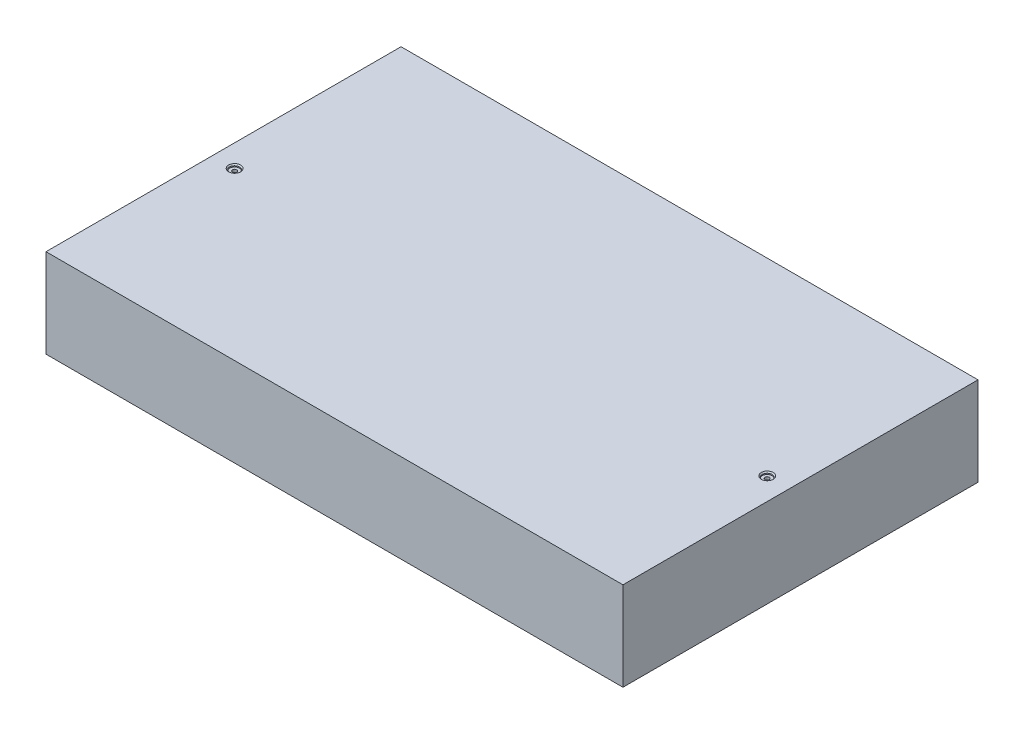
ISO-10303-21;
HEADER;
FILE_DESCRIPTION(('STEP AP214'),'2;1');
FILE_NAME('part.step','',(''),(''),'','','');
FILE_SCHEMA(('AUTOMOTIVE_DESIGN { 1 0 10303 214 1 1 1 1 }'));
ENDSEC;
DATA;
#1=APPLICATION_CONTEXT('core data for automotive mechanical design processes');
#2=APPLICATION_PROTOCOL_DEFINITION('international standard','automotive_design',2000,#1);
#3=PRODUCT_CONTEXT('',#1,'mechanical');
#4=PRODUCT('Part','Part','',(#3));
#5=PRODUCT_RELATED_PRODUCT_CATEGORY('part','',(#4));
#6=PRODUCT_DEFINITION_FORMATION('','',#4);
#7=PRODUCT_DEFINITION_CONTEXT('part definition',#1,'design');
#8=PRODUCT_DEFINITION('design','',#6,#7);
#9=PRODUCT_DEFINITION_SHAPE('','',#8);
#10=(LENGTH_UNIT() NAMED_UNIT(*) SI_UNIT(.MILLI.,.METRE.));
#11=(NAMED_UNIT(*) PLANE_ANGLE_UNIT() SI_UNIT($,.RADIAN.));
#12=(NAMED_UNIT(*) SI_UNIT($,.STERADIAN.) SOLID_ANGLE_UNIT());
#13=UNCERTAINTY_MEASURE_WITH_UNIT(LENGTH_MEASURE(1.E-05),#10,'distance_accuracy_value','');
#14=(GEOMETRIC_REPRESENTATION_CONTEXT(3) GLOBAL_UNCERTAINTY_ASSIGNED_CONTEXT((#13)) GLOBAL_UNIT_ASSIGNED_CONTEXT((#10,
#11,#12)) REPRESENTATION_CONTEXT('',''));
#15=CARTESIAN_POINT('',(0.,0.,0.));
#16=DIRECTION('',(0.,0.,1.));
#17=DIRECTION('',(1.,0.,0.));
#18=AXIS2_PLACEMENT_3D('',#15,#16,#17);
#19=CARTESIAN_POINT('',(0.,0.,0.));
#20=DIRECTION('',(0.,-1.,0.));
#21=DIRECTION('',(0.,0.,-1.));
#22=AXIS2_PLACEMENT_3D('',#19,#20,#21);
#23=PLANE('',#22);
#24=CARTESIAN_POINT('',(12.7009405747543,0.,-95.25));
#25=DIRECTION('',(0.,1.,0.));
#26=DIRECTION('',(0.,0.,1.));
#27=AXIS2_PLACEMENT_3D('',#24,#25,#26);
#28=CIRCLE('',#27,1.21919999999999);
#29=CARTESIAN_POINT('',(12.7009405747543,0.,-94.0308));
#30=VERTEX_POINT('',#29);
#31=EDGE_CURVE('E261',#30,#30,#28,.T.);
#32=ORIENTED_EDGE('',*,*,#31,.T.);
#33=EDGE_LOOP('',(#32));
#34=FACE_BOUND('',#33,.T.);
#35=CARTESIAN_POINT('',(317.5,0.,-95.25));
#36=DIRECTION('',(0.,1.,0.));
#37=DIRECTION('',(0.,0.,1.));
#38=AXIS2_PLACEMENT_3D('',#35,#36,#37);
#39=CIRCLE('',#38,1.21919999999998);
#40=CARTESIAN_POINT('',(317.5,0.,-94.0308));
#41=VERTEX_POINT('',#40);
#42=EDGE_CURVE('E133',#41,#41,#39,.T.);
#43=ORIENTED_EDGE('',*,*,#42,.T.);
#44=EDGE_LOOP('',(#43));
#45=FACE_BOUND('',#44,.T.);
#46=DIRECTION('',(0.,0.,1.));
#47=VECTOR('',#46,1.);
#48=CARTESIAN_POINT('',(0.,0.,0.));
#49=LINE('',#48,#47);
#50=CARTESIAN_POINT('',(0.,0.,-203.2));
#51=VERTEX_POINT('',#50);
#52=CARTESIAN_POINT('',(0.,0.,0.));
#53=VERTEX_POINT('',#52);
#54=EDGE_CURVE('E145',#51,#53,#49,.T.);
#55=ORIENTED_EDGE('',*,*,#54,.F.);
#56=DIRECTION('',(-1.,0.,0.));
#57=VECTOR('',#56,1.);
#58=CARTESIAN_POINT('',(0.,0.,-203.2));
#59=LINE('',#58,#57);
#60=CARTESIAN_POINT('',(330.2,0.,-203.2));
#61=VERTEX_POINT('',#60);
#62=EDGE_CURVE('E78',#61,#51,#59,.T.);
#63=ORIENTED_EDGE('',*,*,#62,.F.);
#64=DIRECTION('',(0.,0.,-1.));
#65=VECTOR('',#64,1.);
#66=CARTESIAN_POINT('',(330.2,0.,0.));
#67=LINE('',#66,#65);
#68=CARTESIAN_POINT('',(330.2,0.,0.));
#69=VERTEX_POINT('',#68);
#70=EDGE_CURVE('E160',#69,#61,#67,.T.);
#71=ORIENTED_EDGE('',*,*,#70,.F.);
#72=DIRECTION('',(1.,0.,0.));
#73=VECTOR('',#72,1.);
#74=CARTESIAN_POINT('',(0.,0.,0.));
#75=LINE('',#74,#73);
#76=EDGE_CURVE('E158',#53,#69,#75,.T.);
#77=ORIENTED_EDGE('',*,*,#76,.F.);
#78=EDGE_LOOP('',(#55,#63,#71,#77));
#79=FACE_BOUND('',#78,.T.);
#80=DIRECTION('',(1.,0.,0.));
#81=VECTOR('',#80,1.);
#82=CARTESIAN_POINT('',(0.,0.,-21.9340173859205));
#83=LINE('',#82,#81);
#84=CARTESIAN_POINT('',(50.8,0.,-21.9340173859205));
#85=VERTEX_POINT('',#84);
#86=CARTESIAN_POINT('',(279.4,0.,-21.9340173859205));
#87=VERTEX_POINT('',#86);
#88=EDGE_CURVE('E139',#85,#87,#83,.T.);
#89=ORIENTED_EDGE('',*,*,#88,.T.);
#90=DIRECTION('',(0.,0.,-1.));
#91=VECTOR('',#90,1.);
#92=CARTESIAN_POINT('',(279.4,0.,0.));
#93=LINE('',#92,#91);
#94=CARTESIAN_POINT('',(279.4,0.,-181.265982614079));
#95=VERTEX_POINT('',#94);
#96=EDGE_CURVE('E48',#87,#95,#93,.T.);
#97=ORIENTED_EDGE('',*,*,#96,.T.);
#98=DIRECTION('',(1.,0.,0.));
#99=VECTOR('',#98,1.);
#100=CARTESIAN_POINT('',(0.,0.,-181.265982614079));
#101=LINE('',#100,#99);
#102=CARTESIAN_POINT('',(50.8,0.,-181.265982614079));
#103=VERTEX_POINT('',#102);
#104=EDGE_CURVE('E127',#103,#95,#101,.T.);
#105=ORIENTED_EDGE('',*,*,#104,.F.);
#106=DIRECTION('',(0.,0.,-1.));
#107=VECTOR('',#106,1.);
#108=CARTESIAN_POINT('',(50.8,0.,0.));
#109=LINE('',#108,#107);
#110=EDGE_CURVE('E130',#85,#103,#109,.T.);
#111=ORIENTED_EDGE('',*,*,#110,.F.);
#112=EDGE_LOOP('',(#89,#97,#105,#111));
#113=FACE_BOUND('',#112,.T.);
#114=ADVANCED_FACE('F33',(#34,#45,#79,#113),#23,.T.);
#115=CARTESIAN_POINT('',(0.,50.8,0.));
#116=DIRECTION('',(1.,0.,0.));
#117=DIRECTION('',(0.,0.,-1.));
#118=AXIS2_PLACEMENT_3D('',#115,#116,#117);
#119=PLANE('',#118);
#120=ORIENTED_EDGE('',*,*,#54,.T.);
#121=DIRECTION('',(0.,-1.,0.));
#122=VECTOR('',#121,1.);
#123=CARTESIAN_POINT('',(0.,50.8,0.));
#124=LINE('',#123,#122);
#125=CARTESIAN_POINT('',(0.,50.8,0.));
#126=VERTEX_POINT('',#125);
#127=EDGE_CURVE('E11',#126,#53,#124,.T.);
#128=ORIENTED_EDGE('',*,*,#127,.F.);
#129=DIRECTION('',(0.,0.,1.));
#130=VECTOR('',#129,1.);
#131=CARTESIAN_POINT('',(0.,50.8,0.));
#132=LINE('',#131,#130);
#133=CARTESIAN_POINT('',(0.,50.8,-203.2));
#134=VERTEX_POINT('',#133);
#135=EDGE_CURVE('E149',#134,#126,#132,.T.);
#136=ORIENTED_EDGE('',*,*,#135,.F.);
#137=DIRECTION('',(0.,-1.,0.));
#138=VECTOR('',#137,1.);
#139=CARTESIAN_POINT('',(0.,50.8,-203.2));
#140=LINE('',#139,#138);
#141=EDGE_CURVE('E155',#134,#51,#140,.T.);
#142=ORIENTED_EDGE('',*,*,#141,.T.);
#143=EDGE_LOOP('',(#120,#128,#136,#142));
#144=FACE_BOUND('',#143,.T.);
#145=ADVANCED_FACE('F35',(#144),#119,.F.);
#146=CARTESIAN_POINT('',(0.,50.8,0.));
#147=DIRECTION('',(0.,0.,-1.));
#148=DIRECTION('',(-1.,0.,0.));
#149=AXIS2_PLACEMENT_3D('',#146,#147,#148);
#150=PLANE('',#149);
#151=ORIENTED_EDGE('',*,*,#76,.T.);
#152=DIRECTION('',(0.,-1.,0.));
#153=VECTOR('',#152,1.);
#154=CARTESIAN_POINT('',(330.2,50.8,0.));
#155=LINE('',#154,#153);
#156=CARTESIAN_POINT('',(330.2,50.8,0.));
#157=VERTEX_POINT('',#156);
#158=EDGE_CURVE('E41',#157,#69,#155,.T.);
#159=ORIENTED_EDGE('',*,*,#158,.F.);
#160=DIRECTION('',(1.,0.,0.));
#161=VECTOR('',#160,1.);
#162=CARTESIAN_POINT('',(0.,50.8,0.));
#163=LINE('',#162,#161);
#164=EDGE_CURVE('E85',#126,#157,#163,.T.);
#165=ORIENTED_EDGE('',*,*,#164,.F.);
#166=ORIENTED_EDGE('',*,*,#127,.T.);
#167=EDGE_LOOP('',(#151,#159,#165,#166));
#168=FACE_BOUND('',#167,.T.);
#169=ADVANCED_FACE('F187',(#168),#150,.F.);
#170=CARTESIAN_POINT('',(330.2,50.8,0.));
#171=DIRECTION('',(-1.,0.,0.));
#172=DIRECTION('',(0.,0.,1.));
#173=AXIS2_PLACEMENT_3D('',#170,#171,#172);
#174=PLANE('',#173);
#175=ORIENTED_EDGE('',*,*,#70,.T.);
#176=DIRECTION('',(0.,-1.,0.));
#177=VECTOR('',#176,1.);
#178=CARTESIAN_POINT('',(330.2,50.8,-203.2));
#179=LINE('',#178,#177);
#180=CARTESIAN_POINT('',(330.2,50.8,-203.2));
#181=VERTEX_POINT('',#180);
#182=EDGE_CURVE('E164',#181,#61,#179,.T.);
#183=ORIENTED_EDGE('',*,*,#182,.F.);
#184=DIRECTION('',(0.,0.,-1.));
#185=VECTOR('',#184,1.);
#186=CARTESIAN_POINT('',(330.2,50.8,0.));
#187=LINE('',#186,#185);
#188=EDGE_CURVE('E152',#157,#181,#187,.T.);
#189=ORIENTED_EDGE('',*,*,#188,.F.);
#190=ORIENTED_EDGE('',*,*,#158,.T.);
#191=EDGE_LOOP('',(#175,#183,#189,#190));
#192=FACE_BOUND('',#191,.T.);
#193=ADVANCED_FACE('F169',(#192),#174,.F.);
#194=CARTESIAN_POINT('',(0.,50.8,-203.2));
#195=DIRECTION('',(0.,0.,1.));
#196=DIRECTION('',(1.,0.,0.));
#197=AXIS2_PLACEMENT_3D('',#194,#195,#196);
#198=PLANE('',#197);
#199=ORIENTED_EDGE('',*,*,#62,.T.);
#200=ORIENTED_EDGE('',*,*,#141,.F.);
#201=DIRECTION('',(-1.,0.,0.));
#202=VECTOR('',#201,1.);
#203=CARTESIAN_POINT('',(0.,50.8,-203.2));
#204=LINE('',#203,#202);
#205=EDGE_CURVE('E57',#181,#134,#204,.T.);
#206=ORIENTED_EDGE('',*,*,#205,.F.);
#207=ORIENTED_EDGE('',*,*,#182,.T.);
#208=EDGE_LOOP('',(#199,#200,#206,#207));
#209=FACE_BOUND('',#208,.T.);
#210=ADVANCED_FACE('F177',(#209),#198,.F.);
#211=CARTESIAN_POINT('',(0.,50.8,0.));
#212=DIRECTION('',(0.,-1.,0.));
#213=DIRECTION('',(0.,0.,-1.));
#214=AXIS2_PLACEMENT_3D('',#211,#212,#213);
#215=PLANE('',#214);
#216=CARTESIAN_POINT('',(12.7009405747543,50.8,-95.25));
#217=DIRECTION('',(0.,1.,0.));
#218=DIRECTION('',(0.,0.,1.));
#219=AXIS2_PLACEMENT_3D('',#216,#217,#218);
#220=CIRCLE('',#219,3.41376);
#221=CARTESIAN_POINT('',(12.7009405747543,50.8,-91.83624));
#222=VERTEX_POINT('',#221);
#223=EDGE_CURVE('E251',#222,#222,#220,.T.);
#224=ORIENTED_EDGE('',*,*,#223,.F.);
#225=EDGE_LOOP('',(#224));
#226=FACE_BOUND('',#225,.T.);
#227=CARTESIAN_POINT('',(317.5,50.8,-95.25));
#228=DIRECTION('',(0.,1.,0.));
#229=DIRECTION('',(0.,0.,1.));
#230=AXIS2_PLACEMENT_3D('',#227,#228,#229);
#231=CIRCLE('',#230,3.41375999999999);
#232=CARTESIAN_POINT('',(317.5,50.8,-91.83624));
#233=VERTEX_POINT('',#232);
#234=EDGE_CURVE('E263',#233,#233,#231,.T.);
#235=ORIENTED_EDGE('',*,*,#234,.F.);
#236=EDGE_LOOP('',(#235));
#237=FACE_BOUND('',#236,.T.);
#238=ORIENTED_EDGE('',*,*,#135,.T.);
#239=ORIENTED_EDGE('',*,*,#164,.T.);
#240=ORIENTED_EDGE('',*,*,#188,.T.);
#241=ORIENTED_EDGE('',*,*,#205,.T.);
#242=EDGE_LOOP('',(#238,#239,#240,#241));
#243=FACE_BOUND('',#242,.T.);
#244=ADVANCED_FACE('F179',(#226,#237,#243),#215,.F.);
#245=CARTESIAN_POINT('',(279.4,12.7,0.));
#246=DIRECTION('',(-1.,0.,0.));
#247=DIRECTION('',(0.,0.,1.));
#248=AXIS2_PLACEMENT_3D('',#245,#246,#247);
#249=PLANE('',#248);
#250=ORIENTED_EDGE('',*,*,#96,.F.);
#251=DIRECTION('',(0.,-1.,0.));
#252=VECTOR('',#251,1.);
#253=CARTESIAN_POINT('',(279.4,12.7,-21.9340173859205));
#254=LINE('',#253,#252);
#255=CARTESIAN_POINT('',(279.4,12.7,-21.9340173859205));
#256=VERTEX_POINT('',#255);
#257=EDGE_CURVE('E110',#256,#87,#254,.T.);
#258=ORIENTED_EDGE('',*,*,#257,.F.);
#259=DIRECTION('',(0.,0.,-1.));
#260=VECTOR('',#259,1.);
#261=CARTESIAN_POINT('',(279.4,12.7,0.));
#262=LINE('',#261,#260);
#263=CARTESIAN_POINT('',(279.4,12.7,-181.265982614079));
#264=VERTEX_POINT('',#263);
#265=EDGE_CURVE('E118',#256,#264,#262,.T.);
#266=ORIENTED_EDGE('',*,*,#265,.T.);
#267=DIRECTION('',(0.,-1.,0.));
#268=VECTOR('',#267,1.);
#269=CARTESIAN_POINT('',(279.4,12.7,-181.265982614079));
#270=LINE('',#269,#268);
#271=EDGE_CURVE('E143',#264,#95,#270,.T.);
#272=ORIENTED_EDGE('',*,*,#271,.T.);
#273=EDGE_LOOP('',(#250,#258,#266,#272));
#274=FACE_BOUND('',#273,.T.);
#275=ADVANCED_FACE('F120',(#274),#249,.T.);
#276=CARTESIAN_POINT('',(0.,12.7,-181.265982614079));
#277=DIRECTION('',(0.,0.,-1.));
#278=DIRECTION('',(-1.,0.,0.));
#279=AXIS2_PLACEMENT_3D('',#276,#277,#278);
#280=PLANE('',#279);
#281=ORIENTED_EDGE('',*,*,#104,.T.);
#282=ORIENTED_EDGE('',*,*,#271,.F.);
#283=DIRECTION('',(1.,0.,0.));
#284=VECTOR('',#283,1.);
#285=CARTESIAN_POINT('',(0.,12.7,-181.265982614079));
#286=LINE('',#285,#284);
#287=CARTESIAN_POINT('',(50.8,12.7,-181.265982614079));
#288=VERTEX_POINT('',#287);
#289=EDGE_CURVE('E122',#288,#264,#286,.T.);
#290=ORIENTED_EDGE('',*,*,#289,.F.);
#291=DIRECTION('',(0.,-1.,0.));
#292=VECTOR('',#291,1.);
#293=CARTESIAN_POINT('',(50.8,12.7,-181.265982614079));
#294=LINE('',#293,#292);
#295=EDGE_CURVE('E146',#288,#103,#294,.T.);
#296=ORIENTED_EDGE('',*,*,#295,.T.);
#297=EDGE_LOOP('',(#281,#282,#290,#296));
#298=FACE_BOUND('',#297,.T.);
#299=ADVANCED_FACE('F200',(#298),#280,.F.);
#300=CARTESIAN_POINT('',(50.8,12.7,0.));
#301=DIRECTION('',(-1.,0.,0.));
#302=DIRECTION('',(0.,0.,1.));
#303=AXIS2_PLACEMENT_3D('',#300,#301,#302);
#304=PLANE('',#303);
#305=ORIENTED_EDGE('',*,*,#110,.T.);
#306=ORIENTED_EDGE('',*,*,#295,.F.);
#307=DIRECTION('',(0.,0.,-1.));
#308=VECTOR('',#307,1.);
#309=CARTESIAN_POINT('',(50.8,12.7,0.));
#310=LINE('',#309,#308);
#311=CARTESIAN_POINT('',(50.8,12.7,-21.9340173859205));
#312=VERTEX_POINT('',#311);
#313=EDGE_CURVE('E117',#312,#288,#310,.T.);
#314=ORIENTED_EDGE('',*,*,#313,.F.);
#315=DIRECTION('',(0.,-1.,0.));
#316=VECTOR('',#315,1.);
#317=CARTESIAN_POINT('',(50.8,12.7,-21.9340173859205));
#318=LINE('',#317,#316);
#319=EDGE_CURVE('E112',#312,#85,#318,.T.);
#320=ORIENTED_EDGE('',*,*,#319,.T.);
#321=EDGE_LOOP('',(#305,#306,#314,#320));
#322=FACE_BOUND('',#321,.T.);
#323=ADVANCED_FACE('F203',(#322),#304,.F.);
#324=CARTESIAN_POINT('',(0.,12.7,-21.9340173859205));
#325=DIRECTION('',(0.,0.,-1.));
#326=DIRECTION('',(-1.,0.,0.));
#327=AXIS2_PLACEMENT_3D('',#324,#325,#326);
#328=PLANE('',#327);
#329=ORIENTED_EDGE('',*,*,#88,.F.);
#330=ORIENTED_EDGE('',*,*,#319,.F.);
#331=DIRECTION('',(1.,0.,0.));
#332=VECTOR('',#331,1.);
#333=CARTESIAN_POINT('',(0.,12.7,-21.9340173859205));
#334=LINE('',#333,#332);
#335=EDGE_CURVE('E107',#312,#256,#334,.T.);
#336=ORIENTED_EDGE('',*,*,#335,.T.);
#337=ORIENTED_EDGE('',*,*,#257,.T.);
#338=EDGE_LOOP('',(#329,#330,#336,#337));
#339=FACE_BOUND('',#338,.T.);
#340=ADVANCED_FACE('F109',(#339),#328,.T.);
#341=CARTESIAN_POINT('',(0.,12.7,0.));
#342=DIRECTION('',(0.,-1.,0.));
#343=DIRECTION('',(0.,0.,-1.));
#344=AXIS2_PLACEMENT_3D('',#341,#342,#343);
#345=PLANE('',#344);
#346=ORIENTED_EDGE('',*,*,#265,.F.);
#347=ORIENTED_EDGE('',*,*,#335,.F.);
#348=ORIENTED_EDGE('',*,*,#313,.T.);
#349=ORIENTED_EDGE('',*,*,#289,.T.);
#350=EDGE_LOOP('',(#346,#347,#348,#349));
#351=FACE_BOUND('',#350,.T.);
#352=ADVANCED_FACE('F125',(#351),#345,.T.);
#353=CARTESIAN_POINT('',(317.5,50.8,-95.25));
#354=DIRECTION('',(0.,1.,0.));
#355=DIRECTION('',(0.,0.,1.));
#356=AXIS2_PLACEMENT_3D('',#353,#354,#355);
#357=CYLINDRICAL_SURFACE('',#356,1.21919999999998);
#358=ORIENTED_EDGE('',*,*,#42,.F.);
#359=EDGE_LOOP('',(#358));
#360=FACE_BOUND('',#359,.T.);
#361=CARTESIAN_POINT('',(317.5,49.53,-95.25));
#362=DIRECTION('',(0.,1.,0.));
#363=DIRECTION('',(0.,0.,1.));
#364=AXIS2_PLACEMENT_3D('',#361,#362,#363);
#365=CIRCLE('',#364,1.21919999999998);
#366=CARTESIAN_POINT('',(317.5,49.53,-94.0308));
#367=VERTEX_POINT('',#366);
#368=EDGE_CURVE('E271',#367,#367,#365,.T.);
#369=ORIENTED_EDGE('',*,*,#368,.T.);
#370=EDGE_LOOP('',(#369));
#371=FACE_BOUND('',#370,.T.);
#372=ADVANCED_FACE('F212',(#360,#371),#357,.F.);
#373=CARTESIAN_POINT('',(320.27876,49.53,-95.25));
#374=DIRECTION('',(0.,-1.,0.));
#375=DIRECTION('',(0.,0.,-1.));
#376=AXIS2_PLACEMENT_3D('',#373,#374,#375);
#377=PLANE('',#376);
#378=ORIENTED_EDGE('',*,*,#368,.F.);
#379=EDGE_LOOP('',(#378));
#380=FACE_BOUND('',#379,.T.);
#381=CARTESIAN_POINT('',(317.5,49.53,-95.25));
#382=DIRECTION('',(0.,1.,0.));
#383=DIRECTION('',(0.,0.,1.));
#384=AXIS2_PLACEMENT_3D('',#381,#382,#383);
#385=CIRCLE('',#384,2.77875999999999);
#386=CARTESIAN_POINT('',(317.5,49.53,-92.47124));
#387=VERTEX_POINT('',#386);
#388=EDGE_CURVE('E269',#387,#387,#385,.T.);
#389=ORIENTED_EDGE('',*,*,#388,.T.);
#390=EDGE_LOOP('',(#389));
#391=FACE_BOUND('',#390,.T.);
#392=ADVANCED_FACE('F215',(#380,#391),#377,.F.);
#393=CARTESIAN_POINT('',(317.5,50.8,-95.25));
#394=DIRECTION('',(0.,1.,0.));
#395=DIRECTION('',(0.,0.,1.));
#396=AXIS2_PLACEMENT_3D('',#393,#394,#395);
#397=CYLINDRICAL_SURFACE('',#396,2.77875999999999);
#398=ORIENTED_EDGE('',*,*,#388,.F.);
#399=EDGE_LOOP('',(#398));
#400=FACE_BOUND('',#399,.T.);
#401=CARTESIAN_POINT('',(317.5,50.165,-95.25));
#402=DIRECTION('',(0.,1.,0.));
#403=DIRECTION('',(0.,0.,1.));
#404=AXIS2_PLACEMENT_3D('',#401,#402,#403);
#405=CIRCLE('',#404,2.77875999999999);
#406=CARTESIAN_POINT('',(317.5,50.165,-92.47124));
#407=VERTEX_POINT('',#406);
#408=EDGE_CURVE('E266',#407,#407,#405,.T.);
#409=ORIENTED_EDGE('',*,*,#408,.T.);
#410=EDGE_LOOP('',(#409));
#411=FACE_BOUND('',#410,.T.);
#412=ADVANCED_FACE('F219',(#400,#411),#397,.F.);
#413=CARTESIAN_POINT('',(317.5,50.8,-95.25));
#414=DIRECTION('',(0.,1.,0.));
#415=DIRECTION('',(0.,0.,1.));
#416=AXIS2_PLACEMENT_3D('',#413,#414,#415);
#417=CONICAL_SURFACE('',#416,3.41375999999999,0.785398163397448);
#418=ORIENTED_EDGE('',*,*,#408,.F.);
#419=EDGE_LOOP('',(#418));
#420=FACE_BOUND('',#419,.T.);
#421=ORIENTED_EDGE('',*,*,#234,.T.);
#422=EDGE_LOOP('',(#421));
#423=FACE_BOUND('',#422,.T.);
#424=ADVANCED_FACE('F223',(#420,#423),#417,.F.);
#425=CARTESIAN_POINT('',(12.7009405747543,50.8,-95.25));
#426=DIRECTION('',(0.,1.,0.));
#427=DIRECTION('',(0.,0.,1.));
#428=AXIS2_PLACEMENT_3D('',#425,#426,#427);
#429=CYLINDRICAL_SURFACE('',#428,1.21919999999999);
#430=ORIENTED_EDGE('',*,*,#31,.F.);
#431=EDGE_LOOP('',(#430));
#432=FACE_BOUND('',#431,.T.);
#433=CARTESIAN_POINT('',(12.7009405747543,49.53,-95.25));
#434=DIRECTION('',(0.,1.,0.));
#435=DIRECTION('',(0.,0.,1.));
#436=AXIS2_PLACEMENT_3D('',#433,#434,#435);
#437=CIRCLE('',#436,1.2192);
#438=CARTESIAN_POINT('',(12.7009405747543,49.53,-94.0308));
#439=VERTEX_POINT('',#438);
#440=EDGE_CURVE('E258',#439,#439,#437,.T.);
#441=ORIENTED_EDGE('',*,*,#440,.T.);
#442=EDGE_LOOP('',(#441));
#443=FACE_BOUND('',#442,.T.);
#444=ADVANCED_FACE('F227',(#432,#443),#429,.F.);
#445=CARTESIAN_POINT('',(15.4797005747543,49.53,-95.25));
#446=DIRECTION('',(0.,-1.,0.));
#447=DIRECTION('',(0.,0.,-1.));
#448=AXIS2_PLACEMENT_3D('',#445,#446,#447);
#449=PLANE('',#448);
#450=ORIENTED_EDGE('',*,*,#440,.F.);
#451=EDGE_LOOP('',(#450));
#452=FACE_BOUND('',#451,.T.);
#453=CARTESIAN_POINT('',(12.7009405747543,49.53,-95.25));
#454=DIRECTION('',(0.,1.,0.));
#455=DIRECTION('',(0.,0.,1.));
#456=AXIS2_PLACEMENT_3D('',#453,#454,#455);
#457=CIRCLE('',#456,2.77876);
#458=CARTESIAN_POINT('',(12.7009405747543,49.53,-92.47124));
#459=VERTEX_POINT('',#458);
#460=EDGE_CURVE('E253',#459,#459,#457,.T.);
#461=ORIENTED_EDGE('',*,*,#460,.T.);
#462=EDGE_LOOP('',(#461));
#463=FACE_BOUND('',#462,.T.);
#464=ADVANCED_FACE('F231',(#452,#463),#449,.F.);
#465=CARTESIAN_POINT('',(12.7009405747543,50.8,-95.25));
#466=DIRECTION('',(0.,1.,0.));
#467=DIRECTION('',(0.,0.,1.));
#468=AXIS2_PLACEMENT_3D('',#465,#466,#467);
#469=CYLINDRICAL_SURFACE('',#468,2.77876);
#470=ORIENTED_EDGE('',*,*,#460,.F.);
#471=EDGE_LOOP('',(#470));
#472=FACE_BOUND('',#471,.T.);
#473=CARTESIAN_POINT('',(12.7009405747543,50.165,-95.25));
#474=DIRECTION('',(0.,1.,0.));
#475=DIRECTION('',(0.,0.,1.));
#476=AXIS2_PLACEMENT_3D('',#473,#474,#475);
#477=CIRCLE('',#476,2.77876);
#478=CARTESIAN_POINT('',(12.7009405747543,50.165,-92.47124));
#479=VERTEX_POINT('',#478);
#480=EDGE_CURVE('E248',#479,#479,#477,.T.);
#481=ORIENTED_EDGE('',*,*,#480,.T.);
#482=EDGE_LOOP('',(#481));
#483=FACE_BOUND('',#482,.T.);
#484=ADVANCED_FACE('F235',(#472,#483),#469,.F.);
#485=CARTESIAN_POINT('',(12.7009405747543,50.8,-95.25));
#486=DIRECTION('',(0.,1.,0.));
#487=DIRECTION('',(0.,0.,1.));
#488=AXIS2_PLACEMENT_3D('',#485,#486,#487);
#489=CONICAL_SURFACE('',#488,3.41376,0.785398163397451);
#490=ORIENTED_EDGE('',*,*,#480,.F.);
#491=EDGE_LOOP('',(#490));
#492=FACE_BOUND('',#491,.T.);
#493=ORIENTED_EDGE('',*,*,#223,.T.);
#494=EDGE_LOOP('',(#493));
#495=FACE_BOUND('',#494,.T.);
#496=ADVANCED_FACE('F239',(#492,#495),#489,.F.);
#497=CLOSED_SHELL('',(#114,#145,#169,#193,#210,#244,#275,#299,#323,#340,#352,#372,#392,#412,
#424,#444,#464,#484,#496));
#498=MANIFOLD_SOLID_BREP('B2',#497);
#499=ADVANCED_BREP_SHAPE_REPRESENTATION('',(#18,#498),#14);
#500=SHAPE_DEFINITION_REPRESENTATION(#9,#499);
ENDSEC;
END-ISO-10303-21;
